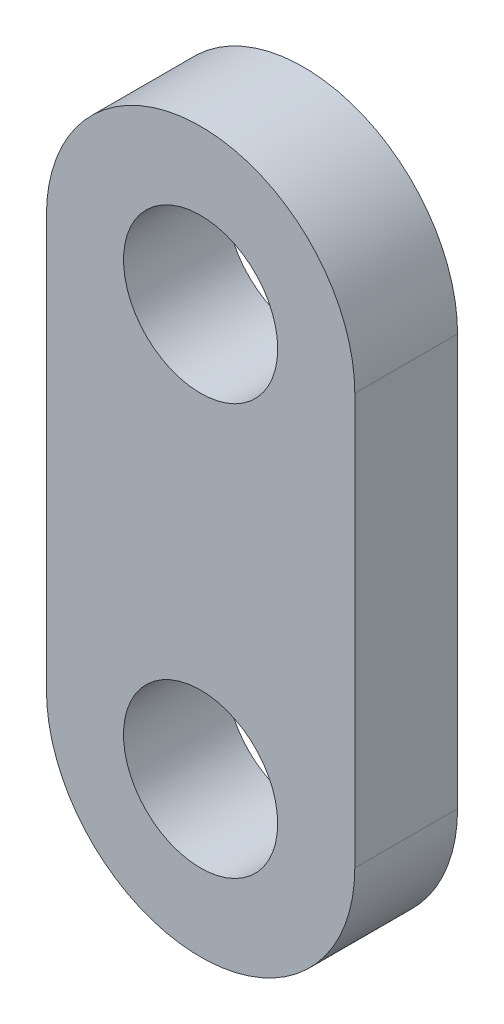
ISO-10303-21;
HEADER;
FILE_DESCRIPTION(('STEP AP214'),'2;1');
FILE_NAME('part.step','',(''),(''),'','','');
FILE_SCHEMA(('AUTOMOTIVE_DESIGN { 1 0 10303 214 1 1 1 1 }'));
ENDSEC;
DATA;
#1=APPLICATION_CONTEXT('core data for automotive mechanical design processes');
#2=APPLICATION_PROTOCOL_DEFINITION('international standard','automotive_design',2000,#1);
#3=PRODUCT_CONTEXT('',#1,'mechanical');
#4=PRODUCT('Part','Part','',(#3));
#5=PRODUCT_RELATED_PRODUCT_CATEGORY('part','',(#4));
#6=PRODUCT_DEFINITION_FORMATION('','',#4);
#7=PRODUCT_DEFINITION_CONTEXT('part definition',#1,'design');
#8=PRODUCT_DEFINITION('design','',#6,#7);
#9=PRODUCT_DEFINITION_SHAPE('','',#8);
#10=(LENGTH_UNIT() NAMED_UNIT(*) SI_UNIT(.MILLI.,.METRE.));
#11=(NAMED_UNIT(*) PLANE_ANGLE_UNIT() SI_UNIT($,.RADIAN.));
#12=(NAMED_UNIT(*) SI_UNIT($,.STERADIAN.) SOLID_ANGLE_UNIT());
#13=UNCERTAINTY_MEASURE_WITH_UNIT(LENGTH_MEASURE(1.E-05),#10,'distance_accuracy_value','');
#14=(GEOMETRIC_REPRESENTATION_CONTEXT(3) GLOBAL_UNCERTAINTY_ASSIGNED_CONTEXT((#13)) GLOBAL_UNIT_ASSIGNED_CONTEXT((#10,
#11,#12)) REPRESENTATION_CONTEXT('',''));
#15=CARTESIAN_POINT('',(0.,0.,0.));
#16=DIRECTION('',(0.,0.,1.));
#17=DIRECTION('',(1.,0.,0.));
#18=AXIS2_PLACEMENT_3D('',#15,#16,#17);
#19=CARTESIAN_POINT('',(4.7625,0.,3.175));
#20=DIRECTION('',(1.,0.,0.));
#21=DIRECTION('',(0.,1.,0.));
#22=AXIS2_PLACEMENT_3D('',#19,#20,#21);
#23=PLANE('',#22);
#24=DIRECTION('',(0.,-1.,0.));
#25=VECTOR('',#24,1.);
#26=CARTESIAN_POINT('',(4.7625,0.,0.));
#27=LINE('',#26,#25);
#28=CARTESIAN_POINT('',(4.7625,12.7,0.));
#29=VERTEX_POINT('',#28);
#30=CARTESIAN_POINT('',(4.7625,0.,0.));
#31=VERTEX_POINT('',#30);
#32=EDGE_CURVE('E103',#29,#31,#27,.T.);
#33=ORIENTED_EDGE('',*,*,#32,.F.);
#34=DIRECTION('',(0.,0.,-1.));
#35=VECTOR('',#34,1.);
#36=CARTESIAN_POINT('',(4.7625,12.7,3.175));
#37=LINE('',#36,#35);
#38=CARTESIAN_POINT('',(4.7625,12.7,3.175));
#39=VERTEX_POINT('',#38);
#40=EDGE_CURVE('E11',#39,#29,#37,.T.);
#41=ORIENTED_EDGE('',*,*,#40,.F.);
#42=DIRECTION('',(0.,-1.,0.));
#43=VECTOR('',#42,1.);
#44=CARTESIAN_POINT('',(4.7625,0.,3.175));
#45=LINE('',#44,#43);
#46=CARTESIAN_POINT('',(4.7625,0.,3.175));
#47=VERTEX_POINT('',#46);
#48=EDGE_CURVE('E82',#39,#47,#45,.T.);
#49=ORIENTED_EDGE('',*,*,#48,.T.);
#50=DIRECTION('',(0.,0.,-1.));
#51=VECTOR('',#50,1.);
#52=CARTESIAN_POINT('',(4.7625,0.,3.175));
#53=LINE('',#52,#51);
#54=EDGE_CURVE('E71',#47,#31,#53,.T.);
#55=ORIENTED_EDGE('',*,*,#54,.T.);
#56=EDGE_LOOP('',(#33,#41,#49,#55));
#57=FACE_BOUND('',#56,.T.);
#58=ADVANCED_FACE('F33',(#57),#23,.T.);
#59=CARTESIAN_POINT('',(0.,12.7,3.175));
#60=DIRECTION('',(0.,0.,-1.));
#61=DIRECTION('',(-1.,0.,0.));
#62=AXIS2_PLACEMENT_3D('',#59,#60,#61);
#63=CYLINDRICAL_SURFACE('',#62,4.7625);
#64=CARTESIAN_POINT('',(0.,12.7,0.));
#65=DIRECTION('',(0.,0.,1.));
#66=DIRECTION('',(1.,0.,0.));
#67=AXIS2_PLACEMENT_3D('',#64,#65,#66);
#68=CIRCLE('',#67,4.7625);
#69=CARTESIAN_POINT('',(-4.7625,12.7,0.));
#70=VERTEX_POINT('',#69);
#71=EDGE_CURVE('E88',#29,#70,#68,.T.);
#72=ORIENTED_EDGE('',*,*,#71,.T.);
#73=DIRECTION('',(0.,0.,-1.));
#74=VECTOR('',#73,1.);
#75=CARTESIAN_POINT('',(-4.7625,12.7,3.175));
#76=LINE('',#75,#74);
#77=CARTESIAN_POINT('',(-4.7625,12.7,3.175));
#78=VERTEX_POINT('',#77);
#79=EDGE_CURVE('E41',#78,#70,#76,.T.);
#80=ORIENTED_EDGE('',*,*,#79,.F.);
#81=CARTESIAN_POINT('',(0.,12.7,3.175));
#82=DIRECTION('',(0.,0.,1.));
#83=DIRECTION('',(1.,0.,0.));
#84=AXIS2_PLACEMENT_3D('',#81,#82,#83);
#85=CIRCLE('',#84,4.7625);
#86=EDGE_CURVE('E76',#39,#78,#85,.T.);
#87=ORIENTED_EDGE('',*,*,#86,.F.);
#88=ORIENTED_EDGE('',*,*,#40,.T.);
#89=EDGE_LOOP('',(#72,#80,#87,#88));
#90=FACE_BOUND('',#89,.T.);
#91=ADVANCED_FACE('F86',(#90),#63,.T.);
#92=CARTESIAN_POINT('',(-4.7625,0.,3.175));
#93=DIRECTION('',(-1.,0.,0.));
#94=DIRECTION('',(0.,-1.,0.));
#95=AXIS2_PLACEMENT_3D('',#92,#93,#94);
#96=PLANE('',#95);
#97=DIRECTION('',(0.,1.,0.));
#98=VECTOR('',#97,1.);
#99=CARTESIAN_POINT('',(-4.7625,0.,0.));
#100=LINE('',#99,#98);
#101=CARTESIAN_POINT('',(-4.7625,0.,0.));
#102=VERTEX_POINT('',#101);
#103=EDGE_CURVE('E107',#102,#70,#100,.T.);
#104=ORIENTED_EDGE('',*,*,#103,.F.);
#105=DIRECTION('',(0.,0.,-1.));
#106=VECTOR('',#105,1.);
#107=CARTESIAN_POINT('',(-4.7625,0.,3.175));
#108=LINE('',#107,#106);
#109=CARTESIAN_POINT('',(-4.7625,0.,3.175));
#110=VERTEX_POINT('',#109);
#111=EDGE_CURVE('E64',#110,#102,#108,.T.);
#112=ORIENTED_EDGE('',*,*,#111,.F.);
#113=DIRECTION('',(0.,1.,0.));
#114=VECTOR('',#113,1.);
#115=CARTESIAN_POINT('',(-4.7625,0.,3.175));
#116=LINE('',#115,#114);
#117=EDGE_CURVE('E81',#110,#78,#116,.T.);
#118=ORIENTED_EDGE('',*,*,#117,.T.);
#119=ORIENTED_EDGE('',*,*,#79,.T.);
#120=EDGE_LOOP('',(#104,#112,#118,#119));
#121=FACE_BOUND('',#120,.T.);
#122=ADVANCED_FACE('F92',(#121),#96,.T.);
#123=CARTESIAN_POINT('',(0.,0.,3.175));
#124=DIRECTION('',(0.,0.,-1.));
#125=DIRECTION('',(-1.,0.,0.));
#126=AXIS2_PLACEMENT_3D('',#123,#124,#125);
#127=CYLINDRICAL_SURFACE('',#126,2.38125);
#128=CARTESIAN_POINT('',(0.,0.,3.175));
#129=DIRECTION('',(0.,0.,1.));
#130=DIRECTION('',(1.,0.,0.));
#131=AXIS2_PLACEMENT_3D('',#128,#129,#130);
#132=CIRCLE('',#131,2.38125);
#133=CARTESIAN_POINT('',(2.38125,0.,3.175));
#134=VERTEX_POINT('',#133);
#135=EDGE_CURVE('E94',#134,#134,#132,.T.);
#136=ORIENTED_EDGE('',*,*,#135,.T.);
#137=EDGE_LOOP('',(#136));
#138=FACE_BOUND('',#137,.T.);
#139=CARTESIAN_POINT('',(0.,0.,0.));
#140=DIRECTION('',(0.,0.,1.));
#141=DIRECTION('',(1.,0.,0.));
#142=AXIS2_PLACEMENT_3D('',#139,#140,#141);
#143=CIRCLE('',#142,2.38125);
#144=CARTESIAN_POINT('',(2.38125,0.,0.));
#145=VERTEX_POINT('',#144);
#146=EDGE_CURVE('E111',#145,#145,#143,.T.);
#147=ORIENTED_EDGE('',*,*,#146,.F.);
#148=EDGE_LOOP('',(#147));
#149=FACE_BOUND('',#148,.T.);
#150=ADVANCED_FACE('F127',(#138,#149),#127,.F.);
#151=CARTESIAN_POINT('',(0.,0.,3.175));
#152=DIRECTION('',(0.,0.,-1.));
#153=DIRECTION('',(-1.,0.,0.));
#154=AXIS2_PLACEMENT_3D('',#151,#152,#153);
#155=CYLINDRICAL_SURFACE('',#154,4.7625);
#156=CARTESIAN_POINT('',(0.,0.,0.));
#157=DIRECTION('',(0.,0.,1.));
#158=DIRECTION('',(1.,0.,0.));
#159=AXIS2_PLACEMENT_3D('',#156,#157,#158);
#160=CIRCLE('',#159,4.7625);
#161=EDGE_CURVE('E109',#102,#31,#160,.T.);
#162=ORIENTED_EDGE('',*,*,#161,.T.);
#163=ORIENTED_EDGE('',*,*,#54,.F.);
#164=CARTESIAN_POINT('',(0.,0.,3.175));
#165=DIRECTION('',(0.,0.,1.));
#166=DIRECTION('',(1.,0.,0.));
#167=AXIS2_PLACEMENT_3D('',#164,#165,#166);
#168=CIRCLE('',#167,4.7625);
#169=EDGE_CURVE('E49',#110,#47,#168,.T.);
#170=ORIENTED_EDGE('',*,*,#169,.F.);
#171=ORIENTED_EDGE('',*,*,#111,.T.);
#172=EDGE_LOOP('',(#162,#163,#170,#171));
#173=FACE_BOUND('',#172,.T.);
#174=ADVANCED_FACE('F130',(#173),#155,.T.);
#175=CARTESIAN_POINT('',(0.,12.7,3.175));
#176=DIRECTION('',(0.,0.,-1.));
#177=DIRECTION('',(-1.,0.,0.));
#178=AXIS2_PLACEMENT_3D('',#175,#176,#177);
#179=CYLINDRICAL_SURFACE('',#178,2.38125);
#180=CARTESIAN_POINT('',(0.,12.7,3.175));
#181=DIRECTION('',(0.,0.,1.));
#182=DIRECTION('',(1.,0.,0.));
#183=AXIS2_PLACEMENT_3D('',#180,#181,#182);
#184=CIRCLE('',#183,2.38125);
#185=CARTESIAN_POINT('',(2.38125,12.7,3.175));
#186=VERTEX_POINT('',#185);
#187=EDGE_CURVE('E100',#186,#186,#184,.T.);
#188=ORIENTED_EDGE('',*,*,#187,.T.);
#189=EDGE_LOOP('',(#188));
#190=FACE_BOUND('',#189,.T.);
#191=CARTESIAN_POINT('',(0.,12.7,0.));
#192=DIRECTION('',(0.,0.,1.));
#193=DIRECTION('',(1.,0.,0.));
#194=AXIS2_PLACEMENT_3D('',#191,#192,#193);
#195=CIRCLE('',#194,2.38125);
#196=CARTESIAN_POINT('',(2.38125,12.7,0.));
#197=VERTEX_POINT('',#196);
#198=EDGE_CURVE('E114',#197,#197,#195,.T.);
#199=ORIENTED_EDGE('',*,*,#198,.F.);
#200=EDGE_LOOP('',(#199));
#201=FACE_BOUND('',#200,.T.);
#202=ADVANCED_FACE('F133',(#190,#201),#179,.F.);
#203=CARTESIAN_POINT('',(0.,0.,3.175));
#204=DIRECTION('',(0.,0.,1.));
#205=DIRECTION('',(1.,0.,0.));
#206=AXIS2_PLACEMENT_3D('',#203,#204,#205);
#207=PLANE('',#206);
#208=ORIENTED_EDGE('',*,*,#48,.F.);
#209=ORIENTED_EDGE('',*,*,#86,.T.);
#210=ORIENTED_EDGE('',*,*,#117,.F.);
#211=ORIENTED_EDGE('',*,*,#169,.T.);
#212=EDGE_LOOP('',(#208,#209,#210,#211));
#213=FACE_BOUND('',#212,.T.);
#214=ORIENTED_EDGE('',*,*,#135,.F.);
#215=EDGE_LOOP('',(#214));
#216=FACE_BOUND('',#215,.T.);
#217=ORIENTED_EDGE('',*,*,#187,.F.);
#218=EDGE_LOOP('',(#217));
#219=FACE_BOUND('',#218,.T.);
#220=ADVANCED_FACE('F78',(#213,#216,#219),#207,.T.);
#221=CARTESIAN_POINT('',(0.,0.,0.));
#222=DIRECTION('',(0.,0.,1.));
#223=DIRECTION('',(1.,0.,0.));
#224=AXIS2_PLACEMENT_3D('',#221,#222,#223);
#225=PLANE('',#224);
#226=ORIENTED_EDGE('',*,*,#32,.T.);
#227=ORIENTED_EDGE('',*,*,#161,.F.);
#228=ORIENTED_EDGE('',*,*,#103,.T.);
#229=ORIENTED_EDGE('',*,*,#71,.F.);
#230=EDGE_LOOP('',(#226,#227,#228,#229));
#231=FACE_BOUND('',#230,.T.);
#232=ORIENTED_EDGE('',*,*,#146,.T.);
#233=EDGE_LOOP('',(#232));
#234=FACE_BOUND('',#233,.T.);
#235=ORIENTED_EDGE('',*,*,#198,.T.);
#236=EDGE_LOOP('',(#235));
#237=FACE_BOUND('',#236,.T.);
#238=ADVANCED_FACE('F140',(#231,#234,#237),#225,.F.);
#239=CLOSED_SHELL('',(#58,#91,#122,#150,#174,#202,#220,#238));
#240=MANIFOLD_SOLID_BREP('B2',#239);
#241=ADVANCED_BREP_SHAPE_REPRESENTATION('',(#18,#240),#14);
#242=SHAPE_DEFINITION_REPRESENTATION(#9,#241);
ENDSEC;
END-ISO-10303-21;
